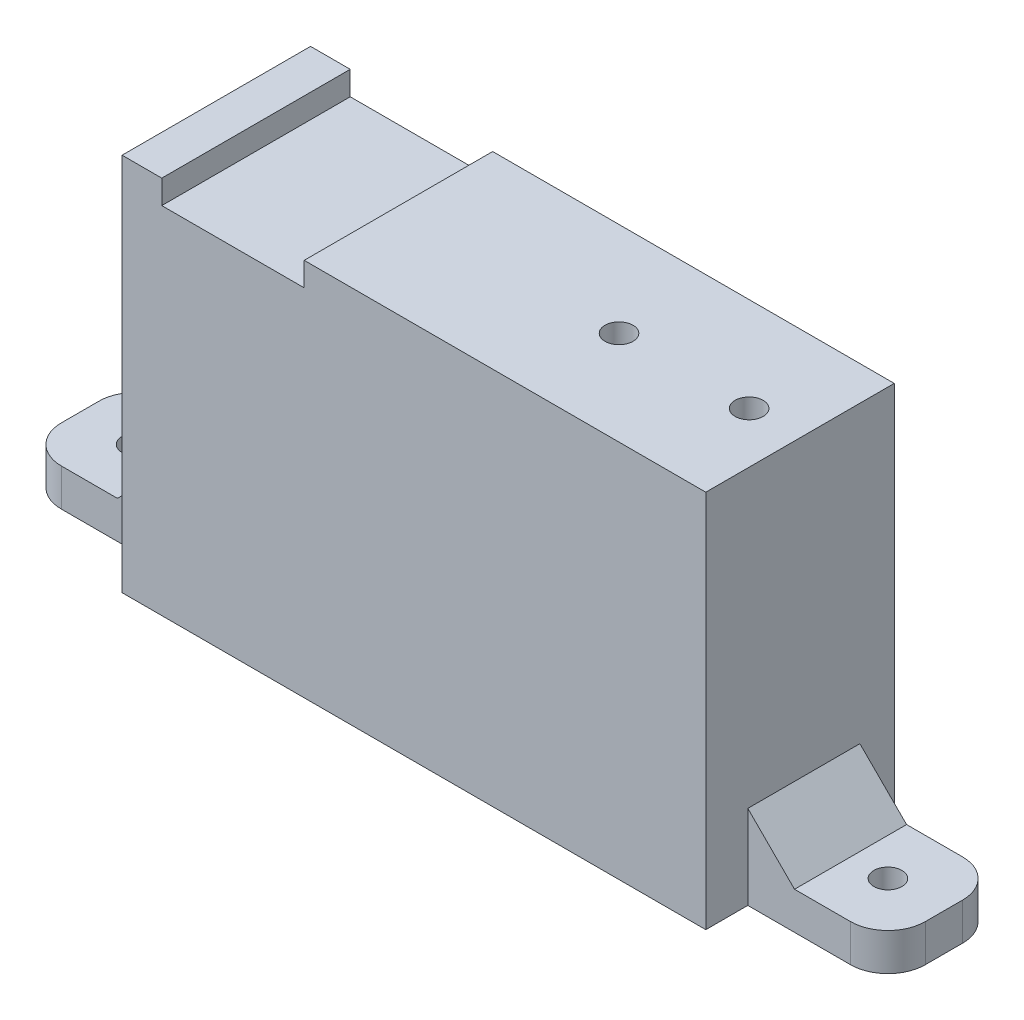
ISO-10303-21;
HEADER;
FILE_DESCRIPTION(('STEP AP214'),'2;1');
FILE_NAME('part.step','',(''),(''),'','','');
FILE_SCHEMA(('AUTOMOTIVE_DESIGN { 1 0 10303 214 1 1 1 1 }'));
ENDSEC;
DATA;
#1=APPLICATION_CONTEXT('core data for automotive mechanical design processes');
#2=APPLICATION_PROTOCOL_DEFINITION('international standard','automotive_design',2000,#1);
#3=PRODUCT_CONTEXT('',#1,'mechanical');
#4=PRODUCT('Part','Part','',(#3));
#5=PRODUCT_RELATED_PRODUCT_CATEGORY('part','',(#4));
#6=PRODUCT_DEFINITION_FORMATION('','',#4);
#7=PRODUCT_DEFINITION_CONTEXT('part definition',#1,'design');
#8=PRODUCT_DEFINITION('design','',#6,#7);
#9=PRODUCT_DEFINITION_SHAPE('','',#8);
#10=(LENGTH_UNIT() NAMED_UNIT(*) SI_UNIT(.MILLI.,.METRE.));
#11=(NAMED_UNIT(*) PLANE_ANGLE_UNIT() SI_UNIT($,.RADIAN.));
#12=(NAMED_UNIT(*) SI_UNIT($,.STERADIAN.) SOLID_ANGLE_UNIT());
#13=UNCERTAINTY_MEASURE_WITH_UNIT(LENGTH_MEASURE(1.E-05),#10,'distance_accuracy_value','');
#14=(GEOMETRIC_REPRESENTATION_CONTEXT(3) GLOBAL_UNCERTAINTY_ASSIGNED_CONTEXT((#13)) GLOBAL_UNIT_ASSIGNED_CONTEXT((#10,
#11,#12)) REPRESENTATION_CONTEXT('',''));
#15=CARTESIAN_POINT('',(0.,0.,0.));
#16=DIRECTION('',(0.,0.,1.));
#17=DIRECTION('',(1.,0.,0.));
#18=AXIS2_PLACEMENT_3D('',#15,#16,#17);
#19=CARTESIAN_POINT('',(31.25,40.57,10.09));
#20=DIRECTION('',(-1.,0.,0.));
#21=DIRECTION('',(0.,0.,1.));
#22=AXIS2_PLACEMENT_3D('',#19,#20,#21);
#23=PLANE('',#22);
#24=DIRECTION('',(0.,0.,-1.));
#25=VECTOR('',#24,1.);
#26=CARTESIAN_POINT('',(31.25,9.00000000000003,-6.41));
#27=LINE('',#26,#25);
#28=CARTESIAN_POINT('',(31.25,9.00000000000003,5.59));
#29=VERTEX_POINT('',#28);
#30=CARTESIAN_POINT('',(31.25,9.00000000000003,-6.41));
#31=VERTEX_POINT('',#30);
#32=EDGE_CURVE('E451',#29,#31,#27,.T.);
#33=ORIENTED_EDGE('',*,*,#32,.T.);
#34=DIRECTION('',(0.,-1.,0.));
#35=VECTOR('',#34,1.);
#36=CARTESIAN_POINT('',(31.25,4.,-6.41));
#37=LINE('',#36,#35);
#38=CARTESIAN_POINT('',(31.25,0.,-6.41));
#39=VERTEX_POINT('',#38);
#40=EDGE_CURVE('E272',#31,#39,#37,.T.);
#41=ORIENTED_EDGE('',*,*,#40,.T.);
#42=DIRECTION('',(0.,0.,-1.));
#43=VECTOR('',#42,1.);
#44=CARTESIAN_POINT('',(31.25,0.,10.09));
#45=LINE('',#44,#43);
#46=CARTESIAN_POINT('',(31.25,0.,-10.09));
#47=VERTEX_POINT('',#46);
#48=EDGE_CURVE('E379',#39,#47,#45,.T.);
#49=ORIENTED_EDGE('',*,*,#48,.T.);
#50=DIRECTION('',(0.,-1.,0.));
#51=VECTOR('',#50,1.);
#52=CARTESIAN_POINT('',(31.25,40.57,-10.09));
#53=LINE('',#52,#51);
#54=CARTESIAN_POINT('',(31.25,40.57,-10.09));
#55=VERTEX_POINT('',#54);
#56=EDGE_CURVE('E434',#55,#47,#53,.T.);
#57=ORIENTED_EDGE('',*,*,#56,.F.);
#58=DIRECTION('',(0.,0.,-1.));
#59=VECTOR('',#58,1.);
#60=CARTESIAN_POINT('',(31.25,40.57,10.09));
#61=LINE('',#60,#59);
#62=CARTESIAN_POINT('',(31.25,40.57,10.09));
#63=VERTEX_POINT('',#62);
#64=EDGE_CURVE('E390',#63,#55,#61,.T.);
#65=ORIENTED_EDGE('',*,*,#64,.F.);
#66=DIRECTION('',(0.,-1.,0.));
#67=VECTOR('',#66,1.);
#68=CARTESIAN_POINT('',(31.25,40.57,10.09));
#69=LINE('',#68,#67);
#70=CARTESIAN_POINT('',(31.25,0.,10.09));
#71=VERTEX_POINT('',#70);
#72=EDGE_CURVE('E408',#63,#71,#69,.T.);
#73=ORIENTED_EDGE('',*,*,#72,.T.);
#74=CARTESIAN_POINT('',(31.25,0.,5.59));
#75=VERTEX_POINT('',#74);
#76=EDGE_CURVE('E409',#71,#75,#45,.T.);
#77=ORIENTED_EDGE('',*,*,#76,.T.);
#78=DIRECTION('',(0.,-1.,0.));
#79=VECTOR('',#78,1.);
#80=CARTESIAN_POINT('',(31.25,4.,5.59));
#81=LINE('',#80,#79);
#82=EDGE_CURVE('E289',#29,#75,#81,.T.);
#83=ORIENTED_EDGE('',*,*,#82,.F.);
#84=EDGE_LOOP('',(#33,#41,#49,#57,#65,#73,#77,#83));
#85=FACE_BOUND('',#84,.T.);
#86=ADVANCED_FACE('F47',(#85),#23,.F.);
#87=CARTESIAN_POINT('',(-31.25,40.57,10.09));
#88=DIRECTION('',(1.,0.,0.));
#89=DIRECTION('',(0.,0.,-1.));
#90=AXIS2_PLACEMENT_3D('',#87,#88,#89);
#91=PLANE('',#90);
#92=DIRECTION('',(0.,0.,1.));
#93=VECTOR('',#92,1.);
#94=CARTESIAN_POINT('',(-31.25,9.00000000000003,10.09));
#95=LINE('',#94,#93);
#96=CARTESIAN_POINT('',(-31.25,9.00000000000003,-6.41));
#97=VERTEX_POINT('',#96);
#98=CARTESIAN_POINT('',(-31.25,9.00000000000003,5.59));
#99=VERTEX_POINT('',#98);
#100=EDGE_CURVE('E438',#97,#99,#95,.T.);
#101=ORIENTED_EDGE('',*,*,#100,.T.);
#102=DIRECTION('',(0.,-1.,0.));
#103=VECTOR('',#102,1.);
#104=CARTESIAN_POINT('',(-31.25,4.,5.59));
#105=LINE('',#104,#103);
#106=CARTESIAN_POINT('',(-31.25,0.,5.59));
#107=VERTEX_POINT('',#106);
#108=EDGE_CURVE('E219',#99,#107,#105,.T.);
#109=ORIENTED_EDGE('',*,*,#108,.T.);
#110=DIRECTION('',(0.,0.,1.));
#111=VECTOR('',#110,1.);
#112=CARTESIAN_POINT('',(-31.25,0.,10.09));
#113=LINE('',#112,#111);
#114=CARTESIAN_POINT('',(-31.25,0.,10.09));
#115=VERTEX_POINT('',#114);
#116=EDGE_CURVE('E416',#107,#115,#113,.T.);
#117=ORIENTED_EDGE('',*,*,#116,.T.);
#118=DIRECTION('',(0.,-1.,0.));
#119=VECTOR('',#118,1.);
#120=CARTESIAN_POINT('',(-31.25,40.57,10.09));
#121=LINE('',#120,#119);
#122=CARTESIAN_POINT('',(-31.25,40.57,10.09));
#123=VERTEX_POINT('',#122);
#124=EDGE_CURVE('E426',#123,#115,#121,.T.);
#125=ORIENTED_EDGE('',*,*,#124,.F.);
#126=DIRECTION('',(0.,0.,1.));
#127=VECTOR('',#126,1.);
#128=CARTESIAN_POINT('',(-31.25,40.57,10.09));
#129=LINE('',#128,#127);
#130=CARTESIAN_POINT('',(-31.25,40.57,-10.09));
#131=VERTEX_POINT('',#130);
#132=EDGE_CURVE('E400',#131,#123,#129,.T.);
#133=ORIENTED_EDGE('',*,*,#132,.F.);
#134=DIRECTION('',(0.,-1.,0.));
#135=VECTOR('',#134,1.);
#136=CARTESIAN_POINT('',(-31.25,40.57,-10.09));
#137=LINE('',#136,#135);
#138=CARTESIAN_POINT('',(-31.25,0.,-10.09));
#139=VERTEX_POINT('',#138);
#140=EDGE_CURVE('E430',#131,#139,#137,.T.);
#141=ORIENTED_EDGE('',*,*,#140,.T.);
#142=CARTESIAN_POINT('',(-31.25,0.,-6.41));
#143=VERTEX_POINT('',#142);
#144=EDGE_CURVE('E417',#139,#143,#113,.T.);
#145=ORIENTED_EDGE('',*,*,#144,.T.);
#146=DIRECTION('',(0.,-1.,0.));
#147=VECTOR('',#146,1.);
#148=CARTESIAN_POINT('',(-31.25,4.,-6.41));
#149=LINE('',#148,#147);
#150=EDGE_CURVE('E257',#97,#143,#149,.T.);
#151=ORIENTED_EDGE('',*,*,#150,.F.);
#152=EDGE_LOOP('',(#101,#109,#117,#125,#133,#141,#145,#151));
#153=FACE_BOUND('',#152,.T.);
#154=ADVANCED_FACE('F500',(#153),#91,.F.);
#155=CARTESIAN_POINT('',(0.,40.57,0.));
#156=DIRECTION('',(0.,-1.,0.));
#157=DIRECTION('',(0.,0.,-1.));
#158=AXIS2_PLACEMENT_3D('',#155,#156,#157);
#159=PLANE('',#158);
#160=DIRECTION('',(1.,0.,0.));
#161=VECTOR('',#160,1.);
#162=CARTESIAN_POINT('',(-31.25,40.57,10.09));
#163=LINE('',#162,#161);
#164=CARTESIAN_POINT('',(-27.,40.57,10.09));
#165=VERTEX_POINT('',#164);
#166=EDGE_CURVE('E404',#123,#165,#163,.T.);
#167=ORIENTED_EDGE('',*,*,#166,.T.);
#168=DIRECTION('',(0.,0.,1.));
#169=VECTOR('',#168,1.);
#170=CARTESIAN_POINT('',(-27.,40.57,-10.09));
#171=LINE('',#170,#169);
#172=CARTESIAN_POINT('',(-27.,40.57,-10.09));
#173=VERTEX_POINT('',#172);
#174=EDGE_CURVE('E342',#173,#165,#171,.T.);
#175=ORIENTED_EDGE('',*,*,#174,.F.);
#176=DIRECTION('',(-1.,0.,0.));
#177=VECTOR('',#176,1.);
#178=CARTESIAN_POINT('',(-31.25,40.57,-10.09));
#179=LINE('',#178,#177);
#180=EDGE_CURVE('E394',#173,#131,#179,.T.);
#181=ORIENTED_EDGE('',*,*,#180,.T.);
#182=ORIENTED_EDGE('',*,*,#132,.T.);
#183=EDGE_LOOP('',(#167,#175,#181,#182));
#184=FACE_BOUND('',#183,.T.);
#185=ADVANCED_FACE('F506',(#184),#159,.F.);
#186=CARTESIAN_POINT('',(-31.25,40.57,-10.09));
#187=DIRECTION('',(0.,0.,1.));
#188=DIRECTION('',(1.,0.,0.));
#189=AXIS2_PLACEMENT_3D('',#186,#187,#188);
#190=PLANE('',#189);
#191=ORIENTED_EDGE('',*,*,#180,.F.);
#192=DIRECTION('',(0.,1.,0.));
#193=VECTOR('',#192,1.);
#194=CARTESIAN_POINT('',(-27.,38.02,-10.09));
#195=LINE('',#194,#193);
#196=CARTESIAN_POINT('',(-27.,38.02,-10.09));
#197=VERTEX_POINT('',#196);
#198=EDGE_CURVE('E376',#197,#173,#195,.T.);
#199=ORIENTED_EDGE('',*,*,#198,.F.);
#200=DIRECTION('',(-1.,0.,0.));
#201=VECTOR('',#200,1.);
#202=CARTESIAN_POINT('',(-27.,38.02,-10.09));
#203=LINE('',#202,#201);
#204=CARTESIAN_POINT('',(-11.75,38.02,-10.09));
#205=VERTEX_POINT('',#204);
#206=EDGE_CURVE('E367',#205,#197,#203,.T.);
#207=ORIENTED_EDGE('',*,*,#206,.F.);
#208=DIRECTION('',(0.,1.,0.));
#209=VECTOR('',#208,1.);
#210=CARTESIAN_POINT('',(-11.75,38.02,-10.09));
#211=LINE('',#210,#209);
#212=CARTESIAN_POINT('',(-11.75,40.57,-10.09));
#213=VERTEX_POINT('',#212);
#214=EDGE_CURVE('E380',#205,#213,#211,.T.);
#215=ORIENTED_EDGE('',*,*,#214,.T.);
#216=EDGE_CURVE('E396',#55,#213,#179,.T.);
#217=ORIENTED_EDGE('',*,*,#216,.F.);
#218=ORIENTED_EDGE('',*,*,#56,.T.);
#219=DIRECTION('',(-1.,0.,0.));
#220=VECTOR('',#219,1.);
#221=CARTESIAN_POINT('',(-31.25,0.,-10.09));
#222=LINE('',#221,#220);
#223=EDGE_CURVE('E413',#47,#139,#222,.T.);
#224=ORIENTED_EDGE('',*,*,#223,.T.);
#225=ORIENTED_EDGE('',*,*,#140,.F.);
#226=EDGE_LOOP('',(#191,#199,#207,#215,#217,#218,#224,#225));
#227=FACE_BOUND('',#226,.T.);
#228=ADVANCED_FACE('F474',(#227),#190,.F.);
#229=CARTESIAN_POINT('',(-31.25,40.57,10.09));
#230=DIRECTION('',(0.,0.,-1.));
#231=DIRECTION('',(-1.,0.,0.));
#232=AXIS2_PLACEMENT_3D('',#229,#230,#231);
#233=PLANE('',#232);
#234=DIRECTION('',(1.,0.,0.));
#235=VECTOR('',#234,1.);
#236=CARTESIAN_POINT('',(-27.,38.02,10.09));
#237=LINE('',#236,#235);
#238=CARTESIAN_POINT('',(-27.,38.02,10.09));
#239=VERTEX_POINT('',#238);
#240=CARTESIAN_POINT('',(-11.75,38.02,10.09));
#241=VERTEX_POINT('',#240);
#242=EDGE_CURVE('E358',#239,#241,#237,.T.);
#243=ORIENTED_EDGE('',*,*,#242,.F.);
#244=DIRECTION('',(0.,1.,0.));
#245=VECTOR('',#244,1.);
#246=CARTESIAN_POINT('',(-27.,38.02,10.09));
#247=LINE('',#246,#245);
#248=EDGE_CURVE('E371',#239,#165,#247,.T.);
#249=ORIENTED_EDGE('',*,*,#248,.T.);
#250=ORIENTED_EDGE('',*,*,#166,.F.);
#251=ORIENTED_EDGE('',*,*,#124,.T.);
#252=DIRECTION('',(1.,0.,0.));
#253=VECTOR('',#252,1.);
#254=CARTESIAN_POINT('',(-31.25,0.,10.09));
#255=LINE('',#254,#253);
#256=EDGE_CURVE('E395',#115,#71,#255,.T.);
#257=ORIENTED_EDGE('',*,*,#256,.T.);
#258=ORIENTED_EDGE('',*,*,#72,.F.);
#259=CARTESIAN_POINT('',(-11.75,40.57,10.09));
#260=VERTEX_POINT('',#259);
#261=EDGE_CURVE('E403',#260,#63,#163,.T.);
#262=ORIENTED_EDGE('',*,*,#261,.F.);
#263=DIRECTION('',(0.,1.,0.));
#264=VECTOR('',#263,1.);
#265=CARTESIAN_POINT('',(-11.75,38.02,10.09));
#266=LINE('',#265,#264);
#267=EDGE_CURVE('E384',#241,#260,#266,.T.);
#268=ORIENTED_EDGE('',*,*,#267,.F.);
#269=EDGE_LOOP('',(#243,#249,#250,#251,#257,#258,#262,#268));
#270=FACE_BOUND('',#269,.T.);
#271=ADVANCED_FACE('F516',(#270),#233,.F.);
#272=CARTESIAN_POINT('',(25.8,40.57,0.));
#273=DIRECTION('',(0.,1.,0.));
#274=DIRECTION('',(0.,0.,1.));
#275=AXIS2_PLACEMENT_3D('',#272,#273,#274);
#276=CIRCLE('',#275,1.5);
#277=CARTESIAN_POINT('',(25.8,40.57,1.5));
#278=VERTEX_POINT('',#277);
#279=EDGE_CURVE('E343',#278,#278,#276,.T.);
#280=ORIENTED_EDGE('',*,*,#279,.F.);
#281=EDGE_LOOP('',(#280));
#282=FACE_BOUND('',#281,.T.);
#283=CARTESIAN_POINT('',(11.87,40.57,0.));
#284=DIRECTION('',(0.,1.,0.));
#285=DIRECTION('',(0.,0.,1.));
#286=AXIS2_PLACEMENT_3D('',#283,#284,#285);
#287=CIRCLE('',#286,1.5);
#288=CARTESIAN_POINT('',(11.87,40.57,1.5));
#289=VERTEX_POINT('',#288);
#290=EDGE_CURVE('E347',#289,#289,#287,.T.);
#291=ORIENTED_EDGE('',*,*,#290,.F.);
#292=EDGE_LOOP('',(#291));
#293=FACE_BOUND('',#292,.T.);
#294=ORIENTED_EDGE('',*,*,#216,.T.);
#295=DIRECTION('',(0.,0.,-1.));
#296=VECTOR('',#295,1.);
#297=CARTESIAN_POINT('',(-11.75,40.57,-10.09));
#298=LINE('',#297,#296);
#299=EDGE_CURVE('E359',#260,#213,#298,.T.);
#300=ORIENTED_EDGE('',*,*,#299,.F.);
#301=ORIENTED_EDGE('',*,*,#261,.T.);
#302=ORIENTED_EDGE('',*,*,#64,.T.);
#303=EDGE_LOOP('',(#294,#300,#301,#302));
#304=FACE_BOUND('',#303,.T.);
#305=ADVANCED_FACE('F478',(#282,#293,#304),#159,.F.);
#306=CARTESIAN_POINT('',(0.,0.,0.));
#307=DIRECTION('',(0.,-1.,0.));
#308=DIRECTION('',(0.,0.,-1.));
#309=AXIS2_PLACEMENT_3D('',#306,#307,#308);
#310=PLANE('',#309);
#311=ORIENTED_EDGE('',*,*,#76,.F.);
#312=ORIENTED_EDGE('',*,*,#256,.F.);
#313=ORIENTED_EDGE('',*,*,#116,.F.);
#314=DIRECTION('',(-1.,0.,0.));
#315=VECTOR('',#314,1.);
#316=CARTESIAN_POINT('',(-31.25,0.,5.59));
#317=LINE('',#316,#315);
#318=CARTESIAN_POINT('',(-42.25,0.,5.59));
#319=VERTEX_POINT('',#318);
#320=EDGE_CURVE('E240',#107,#319,#317,.T.);
#321=ORIENTED_EDGE('',*,*,#320,.T.);
#322=CARTESIAN_POINT('',(-42.25,0.,1.59));
#323=DIRECTION('',(0.,-1.,0.));
#324=DIRECTION('',(0.,0.,1.));
#325=AXIS2_PLACEMENT_3D('',#322,#323,#324);
#326=CIRCLE('',#325,4.);
#327=CARTESIAN_POINT('',(-46.25,0.,1.58999999999997));
#328=VERTEX_POINT('',#327);
#329=EDGE_CURVE('E215',#319,#328,#326,.T.);
#330=ORIENTED_EDGE('',*,*,#329,.T.);
#331=DIRECTION('',(0.,0.,-1.));
#332=VECTOR('',#331,1.);
#333=CARTESIAN_POINT('',(-46.25,0.,1.58999999999997));
#334=LINE('',#333,#332);
#335=CARTESIAN_POINT('',(-46.25,0.,-2.40999999999997));
#336=VERTEX_POINT('',#335);
#337=EDGE_CURVE('E246',#328,#336,#334,.T.);
#338=ORIENTED_EDGE('',*,*,#337,.T.);
#339=CARTESIAN_POINT('',(-42.25,0.,-2.41));
#340=DIRECTION('',(0.,-1.,0.));
#341=DIRECTION('',(0.,0.,1.));
#342=AXIS2_PLACEMENT_3D('',#339,#340,#341);
#343=CIRCLE('',#342,4.);
#344=CARTESIAN_POINT('',(-42.25,0.,-6.41));
#345=VERTEX_POINT('',#344);
#346=EDGE_CURVE('E250',#336,#345,#343,.T.);
#347=ORIENTED_EDGE('',*,*,#346,.T.);
#348=DIRECTION('',(1.,0.,0.));
#349=VECTOR('',#348,1.);
#350=CARTESIAN_POINT('',(-31.25,0.,-6.41));
#351=LINE('',#350,#349);
#352=EDGE_CURVE('E209',#345,#143,#351,.T.);
#353=ORIENTED_EDGE('',*,*,#352,.T.);
#354=ORIENTED_EDGE('',*,*,#144,.F.);
#355=ORIENTED_EDGE('',*,*,#223,.F.);
#356=ORIENTED_EDGE('',*,*,#48,.F.);
#357=DIRECTION('',(1.,0.,0.));
#358=VECTOR('',#357,1.);
#359=CARTESIAN_POINT('',(31.25,0.,-6.41));
#360=LINE('',#359,#358);
#361=CARTESIAN_POINT('',(42.25,0.,-6.41));
#362=VERTEX_POINT('',#361);
#363=EDGE_CURVE('E309',#39,#362,#360,.T.);
#364=ORIENTED_EDGE('',*,*,#363,.T.);
#365=CARTESIAN_POINT('',(42.25,0.,-2.41));
#366=DIRECTION('',(0.,-1.,0.));
#367=DIRECTION('',(0.,0.,-1.));
#368=AXIS2_PLACEMENT_3D('',#365,#366,#367);
#369=CIRCLE('',#368,4.);
#370=CARTESIAN_POINT('',(46.25,0.,-2.40999999999997));
#371=VERTEX_POINT('',#370);
#372=EDGE_CURVE('E305',#362,#371,#369,.T.);
#373=ORIENTED_EDGE('',*,*,#372,.T.);
#374=DIRECTION('',(0.,0.,1.));
#375=VECTOR('',#374,1.);
#376=CARTESIAN_POINT('',(46.25,0.,1.58999999999997));
#377=LINE('',#376,#375);
#378=CARTESIAN_POINT('',(46.25,0.,1.58999999999997));
#379=VERTEX_POINT('',#378);
#380=EDGE_CURVE('E301',#371,#379,#377,.T.);
#381=ORIENTED_EDGE('',*,*,#380,.T.);
#382=CARTESIAN_POINT('',(42.25,0.,1.59));
#383=DIRECTION('',(0.,-1.,0.));
#384=DIRECTION('',(0.,0.,-1.));
#385=AXIS2_PLACEMENT_3D('',#382,#383,#384);
#386=CIRCLE('',#385,4.);
#387=CARTESIAN_POINT('',(42.25,0.,5.59));
#388=VERTEX_POINT('',#387);
#389=EDGE_CURVE('E296',#379,#388,#386,.T.);
#390=ORIENTED_EDGE('',*,*,#389,.T.);
#391=DIRECTION('',(-1.,0.,0.));
#392=VECTOR('',#391,1.);
#393=CARTESIAN_POINT('',(31.25,0.,5.59));
#394=LINE('',#393,#392);
#395=EDGE_CURVE('E292',#388,#75,#394,.T.);
#396=ORIENTED_EDGE('',*,*,#395,.T.);
#397=EDGE_LOOP('',(#311,#312,#313,#321,#330,#338,#347,#353,#354,#355,#356,#364,#373,#381,#390,#396));
#398=FACE_BOUND('',#397,.T.);
#399=CARTESIAN_POINT('',(-40.25,0.,-0.41));
#400=DIRECTION('',(0.,-1.,0.));
#401=DIRECTION('',(0.,0.,-1.));
#402=AXIS2_PLACEMENT_3D('',#399,#400,#401);
#403=CIRCLE('',#402,1.5);
#404=CARTESIAN_POINT('',(-40.25,0.,-1.91));
#405=VERTEX_POINT('',#404);
#406=EDGE_CURVE('E334',#405,#405,#403,.T.);
#407=ORIENTED_EDGE('',*,*,#406,.F.);
#408=EDGE_LOOP('',(#407));
#409=FACE_BOUND('',#408,.T.);
#410=CARTESIAN_POINT('',(40.25,0.,-0.41));
#411=DIRECTION('',(0.,-1.,0.));
#412=DIRECTION('',(0.,0.,1.));
#413=AXIS2_PLACEMENT_3D('',#410,#411,#412);
#414=CIRCLE('',#413,1.5);
#415=CARTESIAN_POINT('',(40.25,0.,1.09));
#416=VERTEX_POINT('',#415);
#417=EDGE_CURVE('E330',#416,#416,#414,.T.);
#418=ORIENTED_EDGE('',*,*,#417,.F.);
#419=EDGE_LOOP('',(#418));
#420=FACE_BOUND('',#419,.T.);
#421=ADVANCED_FACE('F469',(#398,#409,#420),#310,.T.);
#422=CARTESIAN_POINT('',(-27.,38.02,-10.09));
#423=DIRECTION('',(-1.,0.,0.));
#424=DIRECTION('',(0.,0.,1.));
#425=AXIS2_PLACEMENT_3D('',#422,#423,#424);
#426=PLANE('',#425);
#427=ORIENTED_EDGE('',*,*,#174,.T.);
#428=ORIENTED_EDGE('',*,*,#248,.F.);
#429=DIRECTION('',(0.,0.,1.));
#430=VECTOR('',#429,1.);
#431=CARTESIAN_POINT('',(-27.,38.02,-10.09));
#432=LINE('',#431,#430);
#433=EDGE_CURVE('E354',#197,#239,#432,.T.);
#434=ORIENTED_EDGE('',*,*,#433,.F.);
#435=ORIENTED_EDGE('',*,*,#198,.T.);
#436=EDGE_LOOP('',(#427,#428,#434,#435));
#437=FACE_BOUND('',#436,.T.);
#438=ADVANCED_FACE('F522',(#437),#426,.F.);
#439=CARTESIAN_POINT('',(-11.75,38.02,-10.09));
#440=DIRECTION('',(1.,0.,0.));
#441=DIRECTION('',(0.,0.,-1.));
#442=AXIS2_PLACEMENT_3D('',#439,#440,#441);
#443=PLANE('',#442);
#444=ORIENTED_EDGE('',*,*,#299,.T.);
#445=ORIENTED_EDGE('',*,*,#214,.F.);
#446=DIRECTION('',(0.,0.,-1.));
#447=VECTOR('',#446,1.);
#448=CARTESIAN_POINT('',(-11.75,38.02,-10.09));
#449=LINE('',#448,#447);
#450=EDGE_CURVE('E363',#241,#205,#449,.T.);
#451=ORIENTED_EDGE('',*,*,#450,.F.);
#452=ORIENTED_EDGE('',*,*,#267,.T.);
#453=EDGE_LOOP('',(#444,#445,#451,#452));
#454=FACE_BOUND('',#453,.T.);
#455=ADVANCED_FACE('F528',(#454),#443,.F.);
#456=CARTESIAN_POINT('',(0.,38.02,0.));
#457=DIRECTION('',(0.,1.,0.));
#458=DIRECTION('',(0.,0.,1.));
#459=AXIS2_PLACEMENT_3D('',#456,#457,#458);
#460=PLANE('',#459);
#461=ORIENTED_EDGE('',*,*,#433,.T.);
#462=ORIENTED_EDGE('',*,*,#242,.T.);
#463=ORIENTED_EDGE('',*,*,#450,.T.);
#464=ORIENTED_EDGE('',*,*,#206,.T.);
#465=EDGE_LOOP('',(#461,#462,#463,#464));
#466=FACE_BOUND('',#465,.T.);
#467=ADVANCED_FACE('F532',(#466),#460,.T.);
#468=CARTESIAN_POINT('',(11.87,25.57,0.));
#469=DIRECTION('',(0.,1.,0.));
#470=DIRECTION('',(0.,0.,1.));
#471=AXIS2_PLACEMENT_3D('',#468,#469,#470);
#472=CYLINDRICAL_SURFACE('',#471,1.5);
#473=CARTESIAN_POINT('',(11.87,25.57,0.));
#474=DIRECTION('',(0.,1.,0.));
#475=DIRECTION('',(0.,0.,1.));
#476=AXIS2_PLACEMENT_3D('',#473,#474,#475);
#477=CIRCLE('',#476,1.5);
#478=CARTESIAN_POINT('',(11.87,25.57,1.5));
#479=VERTEX_POINT('',#478);
#480=EDGE_CURVE('E260',#479,#479,#477,.T.);
#481=ORIENTED_EDGE('',*,*,#480,.F.);
#482=EDGE_LOOP('',(#481));
#483=FACE_BOUND('',#482,.T.);
#484=ORIENTED_EDGE('',*,*,#290,.T.);
#485=EDGE_LOOP('',(#484));
#486=FACE_BOUND('',#485,.T.);
#487=ADVANCED_FACE('F536',(#483,#486),#472,.F.);
#488=CARTESIAN_POINT('',(11.87,25.57,0.));
#489=DIRECTION('',(0.,1.,0.));
#490=DIRECTION('',(0.,0.,1.));
#491=AXIS2_PLACEMENT_3D('',#488,#489,#490);
#492=PLANE('',#491);
#493=ORIENTED_EDGE('',*,*,#480,.T.);
#494=EDGE_LOOP('',(#493));
#495=FACE_BOUND('',#494,.T.);
#496=ADVANCED_FACE('F538',(#495),#492,.T.);
#497=CARTESIAN_POINT('',(25.8,25.57,0.));
#498=DIRECTION('',(0.,1.,0.));
#499=DIRECTION('',(0.,0.,1.));
#500=AXIS2_PLACEMENT_3D('',#497,#498,#499);
#501=CYLINDRICAL_SURFACE('',#500,1.5);
#502=CARTESIAN_POINT('',(25.8,25.57,0.));
#503=DIRECTION('',(0.,1.,0.));
#504=DIRECTION('',(0.,0.,1.));
#505=AXIS2_PLACEMENT_3D('',#502,#503,#504);
#506=CIRCLE('',#505,1.5);
#507=CARTESIAN_POINT('',(25.8,25.57,1.5));
#508=VERTEX_POINT('',#507);
#509=EDGE_CURVE('E338',#508,#508,#506,.T.);
#510=ORIENTED_EDGE('',*,*,#509,.F.);
#511=EDGE_LOOP('',(#510));
#512=FACE_BOUND('',#511,.T.);
#513=ORIENTED_EDGE('',*,*,#279,.T.);
#514=EDGE_LOOP('',(#513));
#515=FACE_BOUND('',#514,.T.);
#516=ADVANCED_FACE('F541',(#512,#515),#501,.F.);
#517=CARTESIAN_POINT('',(0.,25.57,0.));
#518=DIRECTION('',(0.,1.,0.));
#519=DIRECTION('',(0.,0.,1.));
#520=AXIS2_PLACEMENT_3D('',#517,#518,#519);
#521=PLANE('',#520);
#522=ORIENTED_EDGE('',*,*,#509,.T.);
#523=EDGE_LOOP('',(#522));
#524=FACE_BOUND('',#523,.T.);
#525=ADVANCED_FACE('F548',(#524),#521,.T.);
#526=CARTESIAN_POINT('',(-31.25,4.,-6.41));
#527=DIRECTION('',(0.,0.,-1.));
#528=DIRECTION('',(-1.,0.,0.));
#529=AXIS2_PLACEMENT_3D('',#526,#527,#528);
#530=PLANE('',#529);
#531=ORIENTED_EDGE('',*,*,#352,.F.);
#532=DIRECTION('',(0.,-1.,0.));
#533=VECTOR('',#532,1.);
#534=CARTESIAN_POINT('',(-42.25,4.,-6.41));
#535=LINE('',#534,#533);
#536=CARTESIAN_POINT('',(-42.25,4.,-6.41));
#537=VERTEX_POINT('',#536);
#538=EDGE_CURVE('E261',#537,#345,#535,.T.);
#539=ORIENTED_EDGE('',*,*,#538,.F.);
#540=DIRECTION('',(1.,0.,0.));
#541=VECTOR('',#540,1.);
#542=CARTESIAN_POINT('',(-31.25,4.,-6.41));
#543=LINE('',#542,#541);
#544=CARTESIAN_POINT('',(-36.25,4.,-6.41));
#545=VERTEX_POINT('',#544);
#546=EDGE_CURVE('E236',#537,#545,#543,.T.);
#547=ORIENTED_EDGE('',*,*,#546,.T.);
#548=DIRECTION('',(0.707106781186544,0.707106781186551,0.));
#549=VECTOR('',#548,1.);
#550=CARTESIAN_POINT('',(-31.25,9.00000000000003,-6.41));
#551=LINE('',#550,#549);
#552=EDGE_CURVE('E447',#545,#97,#551,.T.);
#553=ORIENTED_EDGE('',*,*,#552,.T.);
#554=ORIENTED_EDGE('',*,*,#150,.T.);
#555=EDGE_LOOP('',(#531,#539,#547,#553,#554));
#556=FACE_BOUND('',#555,.T.);
#557=ADVANCED_FACE('F552',(#556),#530,.T.);
#558=CARTESIAN_POINT('',(-42.25,4.,-2.41));
#559=DIRECTION('',(0.,-1.,0.));
#560=DIRECTION('',(0.,0.,-1.));
#561=AXIS2_PLACEMENT_3D('',#558,#559,#560);
#562=CYLINDRICAL_SURFACE('',#561,4.);
#563=ORIENTED_EDGE('',*,*,#346,.F.);
#564=DIRECTION('',(0.,-1.,0.));
#565=VECTOR('',#564,1.);
#566=CARTESIAN_POINT('',(-46.25,4.,-2.40999999999997));
#567=LINE('',#566,#565);
#568=CARTESIAN_POINT('',(-46.25,4.,-2.40999999999997));
#569=VERTEX_POINT('',#568);
#570=EDGE_CURVE('E264',#569,#336,#567,.T.);
#571=ORIENTED_EDGE('',*,*,#570,.F.);
#572=CARTESIAN_POINT('',(-42.25,4.,-2.41));
#573=DIRECTION('',(0.,-1.,0.));
#574=DIRECTION('',(0.,0.,1.));
#575=AXIS2_PLACEMENT_3D('',#572,#573,#574);
#576=CIRCLE('',#575,4.);
#577=EDGE_CURVE('E229',#569,#537,#576,.T.);
#578=ORIENTED_EDGE('',*,*,#577,.T.);
#579=ORIENTED_EDGE('',*,*,#538,.T.);
#580=EDGE_LOOP('',(#563,#571,#578,#579));
#581=FACE_BOUND('',#580,.T.);
#582=ADVANCED_FACE('F584',(#581),#562,.T.);
#583=CARTESIAN_POINT('',(-46.25,4.,1.58999999999997));
#584=DIRECTION('',(-1.,0.,0.));
#585=DIRECTION('',(0.,0.,1.));
#586=AXIS2_PLACEMENT_3D('',#583,#584,#585);
#587=PLANE('',#586);
#588=ORIENTED_EDGE('',*,*,#337,.F.);
#589=DIRECTION('',(0.,-1.,0.));
#590=VECTOR('',#589,1.);
#591=CARTESIAN_POINT('',(-46.25,4.,1.58999999999997));
#592=LINE('',#591,#590);
#593=CARTESIAN_POINT('',(-46.25,4.,1.58999999999997));
#594=VERTEX_POINT('',#593);
#595=EDGE_CURVE('E218',#594,#328,#592,.T.);
#596=ORIENTED_EDGE('',*,*,#595,.F.);
#597=DIRECTION('',(0.,0.,-1.));
#598=VECTOR('',#597,1.);
#599=CARTESIAN_POINT('',(-46.25,4.,1.58999999999997));
#600=LINE('',#599,#598);
#601=EDGE_CURVE('E225',#594,#569,#600,.T.);
#602=ORIENTED_EDGE('',*,*,#601,.T.);
#603=ORIENTED_EDGE('',*,*,#570,.T.);
#604=EDGE_LOOP('',(#588,#596,#602,#603));
#605=FACE_BOUND('',#604,.T.);
#606=ADVANCED_FACE('F581',(#605),#587,.T.);
#607=CARTESIAN_POINT('',(-42.25,4.,1.59));
#608=DIRECTION('',(0.,-1.,0.));
#609=DIRECTION('',(0.,0.,-1.));
#610=AXIS2_PLACEMENT_3D('',#607,#608,#609);
#611=CYLINDRICAL_SURFACE('',#610,4.);
#612=ORIENTED_EDGE('',*,*,#329,.F.);
#613=DIRECTION('',(0.,-1.,0.));
#614=VECTOR('',#613,1.);
#615=CARTESIAN_POINT('',(-42.25,4.,5.59));
#616=LINE('',#615,#614);
#617=CARTESIAN_POINT('',(-42.25,4.,5.59));
#618=VERTEX_POINT('',#617);
#619=EDGE_CURVE('E200',#618,#319,#616,.T.);
#620=ORIENTED_EDGE('',*,*,#619,.F.);
#621=CARTESIAN_POINT('',(-42.25,4.,1.59));
#622=DIRECTION('',(0.,-1.,0.));
#623=DIRECTION('',(0.,0.,1.));
#624=AXIS2_PLACEMENT_3D('',#621,#622,#623);
#625=CIRCLE('',#624,4.);
#626=EDGE_CURVE('E208',#618,#594,#625,.T.);
#627=ORIENTED_EDGE('',*,*,#626,.T.);
#628=ORIENTED_EDGE('',*,*,#595,.T.);
#629=EDGE_LOOP('',(#612,#620,#627,#628));
#630=FACE_BOUND('',#629,.T.);
#631=ADVANCED_FACE('F213',(#630),#611,.T.);
#632=CARTESIAN_POINT('',(-31.25,4.,5.59));
#633=DIRECTION('',(0.,0.,1.));
#634=DIRECTION('',(1.,0.,0.));
#635=AXIS2_PLACEMENT_3D('',#632,#633,#634);
#636=PLANE('',#635);
#637=ORIENTED_EDGE('',*,*,#320,.F.);
#638=ORIENTED_EDGE('',*,*,#108,.F.);
#639=DIRECTION('',(-0.707106781186544,-0.707106781186551,0.));
#640=VECTOR('',#639,1.);
#641=CARTESIAN_POINT('',(-31.25,9.00000000000003,5.59));
#642=LINE('',#641,#640);
#643=CARTESIAN_POINT('',(-36.25,4.,5.59));
#644=VERTEX_POINT('',#643);
#645=EDGE_CURVE('E203',#99,#644,#642,.T.);
#646=ORIENTED_EDGE('',*,*,#645,.T.);
#647=DIRECTION('',(-1.,0.,0.));
#648=VECTOR('',#647,1.);
#649=CARTESIAN_POINT('',(-31.25,4.,5.59));
#650=LINE('',#649,#648);
#651=EDGE_CURVE('E197',#644,#618,#650,.T.);
#652=ORIENTED_EDGE('',*,*,#651,.T.);
#653=ORIENTED_EDGE('',*,*,#619,.T.);
#654=EDGE_LOOP('',(#637,#638,#646,#652,#653));
#655=FACE_BOUND('',#654,.T.);
#656=ADVANCED_FACE('F199',(#655),#636,.T.);
#657=CARTESIAN_POINT('',(-42.25,4.,-2.41));
#658=DIRECTION('',(0.,1.,0.));
#659=DIRECTION('',(0.,0.,1.));
#660=AXIS2_PLACEMENT_3D('',#657,#658,#659);
#661=PLANE('',#660);
#662=CARTESIAN_POINT('',(-40.25,4.,-0.41));
#663=DIRECTION('',(0.,-1.,0.));
#664=DIRECTION('',(0.,0.,-1.));
#665=AXIS2_PLACEMENT_3D('',#662,#663,#664);
#666=CIRCLE('',#665,1.5);
#667=CARTESIAN_POINT('',(-40.25,4.,-1.91));
#668=VERTEX_POINT('',#667);
#669=EDGE_CURVE('E243',#668,#668,#666,.T.);
#670=ORIENTED_EDGE('',*,*,#669,.T.);
#671=EDGE_LOOP('',(#670));
#672=FACE_BOUND('',#671,.T.);
#673=ORIENTED_EDGE('',*,*,#651,.F.);
#674=DIRECTION('',(0.,0.,-1.));
#675=VECTOR('',#674,1.);
#676=CARTESIAN_POINT('',(-36.25,4.,-2.41));
#677=LINE('',#676,#675);
#678=EDGE_CURVE('E442',#644,#545,#677,.T.);
#679=ORIENTED_EDGE('',*,*,#678,.T.);
#680=ORIENTED_EDGE('',*,*,#546,.F.);
#681=ORIENTED_EDGE('',*,*,#577,.F.);
#682=ORIENTED_EDGE('',*,*,#601,.F.);
#683=ORIENTED_EDGE('',*,*,#626,.F.);
#684=EDGE_LOOP('',(#673,#679,#680,#681,#682,#683));
#685=FACE_BOUND('',#684,.T.);
#686=ADVANCED_FACE('F222',(#672,#685),#661,.T.);
#687=CARTESIAN_POINT('',(-40.25,4.,-0.41));
#688=DIRECTION('',(0.,-1.,0.));
#689=DIRECTION('',(0.,0.,-1.));
#690=AXIS2_PLACEMENT_3D('',#687,#688,#689);
#691=CYLINDRICAL_SURFACE('',#690,1.5);
#692=ORIENTED_EDGE('',*,*,#669,.F.);
#693=EDGE_LOOP('',(#692));
#694=FACE_BOUND('',#693,.T.);
#695=ORIENTED_EDGE('',*,*,#406,.T.);
#696=EDGE_LOOP('',(#695));
#697=FACE_BOUND('',#696,.T.);
#698=ADVANCED_FACE('F563',(#694,#697),#691,.F.);
#699=CARTESIAN_POINT('',(31.25,4.,5.59));
#700=DIRECTION('',(0.,0.,1.));
#701=DIRECTION('',(1.,0.,0.));
#702=AXIS2_PLACEMENT_3D('',#699,#700,#701);
#703=PLANE('',#702);
#704=ORIENTED_EDGE('',*,*,#395,.F.);
#705=DIRECTION('',(0.,-1.,0.));
#706=VECTOR('',#705,1.);
#707=CARTESIAN_POINT('',(42.25,4.,5.59));
#708=LINE('',#707,#706);
#709=CARTESIAN_POINT('',(42.25,4.,5.59));
#710=VERTEX_POINT('',#709);
#711=EDGE_CURVE('E286',#710,#388,#708,.T.);
#712=ORIENTED_EDGE('',*,*,#711,.F.);
#713=DIRECTION('',(-1.,0.,0.));
#714=VECTOR('',#713,1.);
#715=CARTESIAN_POINT('',(31.25,4.,5.59));
#716=LINE('',#715,#714);
#717=CARTESIAN_POINT('',(36.25,4.,5.59));
#718=VERTEX_POINT('',#717);
#719=EDGE_CURVE('E276',#710,#718,#716,.T.);
#720=ORIENTED_EDGE('',*,*,#719,.T.);
#721=DIRECTION('',(0.707106781186544,-0.707106781186551,0.));
#722=VECTOR('',#721,1.);
#723=CARTESIAN_POINT('',(31.25,9.00000000000003,5.59));
#724=LINE('',#723,#722);
#725=EDGE_CURVE('E11',#718,#29,#724,.F.);
#726=ORIENTED_EDGE('',*,*,#725,.T.);
#727=ORIENTED_EDGE('',*,*,#82,.T.);
#728=EDGE_LOOP('',(#704,#712,#720,#726,#727));
#729=FACE_BOUND('',#728,.T.);
#730=ADVANCED_FACE('F487',(#729),#703,.T.);
#731=CARTESIAN_POINT('',(42.25,4.,1.59));
#732=DIRECTION('',(0.,-1.,0.));
#733=DIRECTION('',(0.,0.,-1.));
#734=AXIS2_PLACEMENT_3D('',#731,#732,#733);
#735=CYLINDRICAL_SURFACE('',#734,4.);
#736=ORIENTED_EDGE('',*,*,#389,.F.);
#737=DIRECTION('',(0.,-1.,0.));
#738=VECTOR('',#737,1.);
#739=CARTESIAN_POINT('',(46.25,4.,1.58999999999997));
#740=LINE('',#739,#738);
#741=CARTESIAN_POINT('',(46.25,4.,1.58999999999997));
#742=VERTEX_POINT('',#741);
#743=EDGE_CURVE('E283',#742,#379,#740,.T.);
#744=ORIENTED_EDGE('',*,*,#743,.F.);
#745=CARTESIAN_POINT('',(42.25,4.,1.59));
#746=DIRECTION('',(0.,-1.,0.));
#747=DIRECTION('',(0.,0.,-1.));
#748=AXIS2_PLACEMENT_3D('',#745,#746,#747);
#749=CIRCLE('',#748,4.);
#750=EDGE_CURVE('E316',#742,#710,#749,.T.);
#751=ORIENTED_EDGE('',*,*,#750,.T.);
#752=ORIENTED_EDGE('',*,*,#711,.T.);
#753=EDGE_LOOP('',(#736,#744,#751,#752));
#754=FACE_BOUND('',#753,.T.);
#755=ADVANCED_FACE('F562',(#754),#735,.T.);
#756=CARTESIAN_POINT('',(46.25,4.,1.58999999999997));
#757=DIRECTION('',(1.,0.,0.));
#758=DIRECTION('',(0.,0.,-1.));
#759=AXIS2_PLACEMENT_3D('',#756,#757,#758);
#760=PLANE('',#759);
#761=ORIENTED_EDGE('',*,*,#380,.F.);
#762=DIRECTION('',(0.,-1.,0.));
#763=VECTOR('',#762,1.);
#764=CARTESIAN_POINT('',(46.25,4.,-2.40999999999997));
#765=LINE('',#764,#763);
#766=CARTESIAN_POINT('',(46.25,4.,-2.40999999999997));
#767=VERTEX_POINT('',#766);
#768=EDGE_CURVE('E280',#767,#371,#765,.T.);
#769=ORIENTED_EDGE('',*,*,#768,.F.);
#770=DIRECTION('',(0.,0.,1.));
#771=VECTOR('',#770,1.);
#772=CARTESIAN_POINT('',(46.25,4.,1.58999999999997));
#773=LINE('',#772,#771);
#774=EDGE_CURVE('E320',#767,#742,#773,.T.);
#775=ORIENTED_EDGE('',*,*,#774,.T.);
#776=ORIENTED_EDGE('',*,*,#743,.T.);
#777=EDGE_LOOP('',(#761,#769,#775,#776));
#778=FACE_BOUND('',#777,.T.);
#779=ADVANCED_FACE('F566',(#778),#760,.T.);
#780=CARTESIAN_POINT('',(42.25,4.,-2.41));
#781=DIRECTION('',(0.,-1.,0.));
#782=DIRECTION('',(0.,0.,-1.));
#783=AXIS2_PLACEMENT_3D('',#780,#781,#782);
#784=CYLINDRICAL_SURFACE('',#783,4.);
#785=ORIENTED_EDGE('',*,*,#372,.F.);
#786=DIRECTION('',(0.,-1.,0.));
#787=VECTOR('',#786,1.);
#788=CARTESIAN_POINT('',(42.25,4.,-6.41));
#789=LINE('',#788,#787);
#790=CARTESIAN_POINT('',(42.25,4.,-6.41));
#791=VERTEX_POINT('',#790);
#792=EDGE_CURVE('E277',#791,#362,#789,.T.);
#793=ORIENTED_EDGE('',*,*,#792,.F.);
#794=CARTESIAN_POINT('',(42.25,4.,-2.41));
#795=DIRECTION('',(0.,-1.,0.));
#796=DIRECTION('',(0.,0.,-1.));
#797=AXIS2_PLACEMENT_3D('',#794,#795,#796);
#798=CIRCLE('',#797,4.);
#799=EDGE_CURVE('E324',#791,#767,#798,.T.);
#800=ORIENTED_EDGE('',*,*,#799,.T.);
#801=ORIENTED_EDGE('',*,*,#768,.T.);
#802=EDGE_LOOP('',(#785,#793,#800,#801));
#803=FACE_BOUND('',#802,.T.);
#804=ADVANCED_FACE('F570',(#803),#784,.T.);
#805=CARTESIAN_POINT('',(31.25,4.,-6.41));
#806=DIRECTION('',(0.,0.,-1.));
#807=DIRECTION('',(-1.,0.,0.));
#808=AXIS2_PLACEMENT_3D('',#805,#806,#807);
#809=PLANE('',#808);
#810=ORIENTED_EDGE('',*,*,#363,.F.);
#811=ORIENTED_EDGE('',*,*,#40,.F.);
#812=DIRECTION('',(-0.707106781186544,0.707106781186551,0.));
#813=VECTOR('',#812,1.);
#814=CARTESIAN_POINT('',(31.25,9.00000000000003,-6.41));
#815=LINE('',#814,#813);
#816=CARTESIAN_POINT('',(36.25,4.,-6.41));
#817=VERTEX_POINT('',#816);
#818=EDGE_CURVE('E57',#31,#817,#815,.F.);
#819=ORIENTED_EDGE('',*,*,#818,.T.);
#820=DIRECTION('',(1.,0.,0.));
#821=VECTOR('',#820,1.);
#822=CARTESIAN_POINT('',(31.25,4.,-6.41));
#823=LINE('',#822,#821);
#824=EDGE_CURVE('E297',#817,#791,#823,.T.);
#825=ORIENTED_EDGE('',*,*,#824,.T.);
#826=ORIENTED_EDGE('',*,*,#792,.T.);
#827=EDGE_LOOP('',(#810,#811,#819,#825,#826));
#828=FACE_BOUND('',#827,.T.);
#829=ADVANCED_FACE('F559',(#828),#809,.T.);
#830=CARTESIAN_POINT('',(42.25,4.,-2.41));
#831=DIRECTION('',(0.,-1.,0.));
#832=DIRECTION('',(0.,0.,-1.));
#833=AXIS2_PLACEMENT_3D('',#830,#831,#832);
#834=PLANE('',#833);
#835=CARTESIAN_POINT('',(40.25,4.,-0.41));
#836=DIRECTION('',(0.,-1.,0.));
#837=DIRECTION('',(0.,0.,1.));
#838=AXIS2_PLACEMENT_3D('',#835,#836,#837);
#839=CIRCLE('',#838,1.5);
#840=CARTESIAN_POINT('',(40.25,4.,1.09));
#841=VERTEX_POINT('',#840);
#842=EDGE_CURVE('E313',#841,#841,#839,.T.);
#843=ORIENTED_EDGE('',*,*,#842,.T.);
#844=EDGE_LOOP('',(#843));
#845=FACE_BOUND('',#844,.T.);
#846=ORIENTED_EDGE('',*,*,#824,.F.);
#847=DIRECTION('',(0.,0.,1.));
#848=VECTOR('',#847,1.);
#849=CARTESIAN_POINT('',(36.25,4.,5.59));
#850=LINE('',#849,#848);
#851=EDGE_CURVE('E70',#817,#718,#850,.T.);
#852=ORIENTED_EDGE('',*,*,#851,.T.);
#853=ORIENTED_EDGE('',*,*,#719,.F.);
#854=ORIENTED_EDGE('',*,*,#750,.F.);
#855=ORIENTED_EDGE('',*,*,#774,.F.);
#856=ORIENTED_EDGE('',*,*,#799,.F.);
#857=EDGE_LOOP('',(#846,#852,#853,#854,#855,#856));
#858=FACE_BOUND('',#857,.T.);
#859=ADVANCED_FACE('F556',(#845,#858),#834,.F.);
#860=CARTESIAN_POINT('',(40.25,4.,-0.41));
#861=DIRECTION('',(0.,-1.,0.));
#862=DIRECTION('',(0.,0.,-1.));
#863=AXIS2_PLACEMENT_3D('',#860,#861,#862);
#864=CYLINDRICAL_SURFACE('',#863,1.5);
#865=ORIENTED_EDGE('',*,*,#842,.F.);
#866=EDGE_LOOP('',(#865));
#867=FACE_BOUND('',#866,.T.);
#868=ORIENTED_EDGE('',*,*,#417,.T.);
#869=EDGE_LOOP('',(#868));
#870=FACE_BOUND('',#869,.T.);
#871=ADVANCED_FACE('F497',(#867,#870),#864,.F.);
#872=CARTESIAN_POINT('',(-31.25,9.00000000000003,10.09));
#873=DIRECTION('',(0.707106781186551,-0.707106781186544,0.));
#874=DIRECTION('',(0.,0.,1.));
#875=AXIS2_PLACEMENT_3D('',#872,#873,#874);
#876=PLANE('',#875);
#877=ORIENTED_EDGE('',*,*,#552,.F.);
#878=ORIENTED_EDGE('',*,*,#678,.F.);
#879=ORIENTED_EDGE('',*,*,#645,.F.);
#880=ORIENTED_EDGE('',*,*,#100,.F.);
#881=EDGE_LOOP('',(#877,#878,#879,#880));
#882=FACE_BOUND('',#881,.T.);
#883=ADVANCED_FACE('F492',(#882),#876,.F.);
#884=CARTESIAN_POINT('',(31.25,9.00000000000003,10.09));
#885=DIRECTION('',(0.707106781186551,0.707106781186544,0.));
#886=DIRECTION('',(0.,0.,1.));
#887=AXIS2_PLACEMENT_3D('',#884,#885,#886);
#888=PLANE('',#887);
#889=ORIENTED_EDGE('',*,*,#725,.F.);
#890=ORIENTED_EDGE('',*,*,#851,.F.);
#891=ORIENTED_EDGE('',*,*,#818,.F.);
#892=ORIENTED_EDGE('',*,*,#32,.F.);
#893=EDGE_LOOP('',(#889,#890,#891,#892));
#894=FACE_BOUND('',#893,.T.);
#895=ADVANCED_FACE('F50',(#894),#888,.T.);
#896=CLOSED_SHELL('',(#86,#154,#185,#228,#271,#305,#421,#438,#455,#467,#487,#496,#516,#525,#557,
#582,#606,#631,#656,#686,#698,#730,#755,#779,#804,#829,#859,#871,#883,#895));
#897=MANIFOLD_SOLID_BREP('B2',#896);
#898=ADVANCED_BREP_SHAPE_REPRESENTATION('',(#18,#897),#14);
#899=SHAPE_DEFINITION_REPRESENTATION(#9,#898);
ENDSEC;
END-ISO-10303-21;
